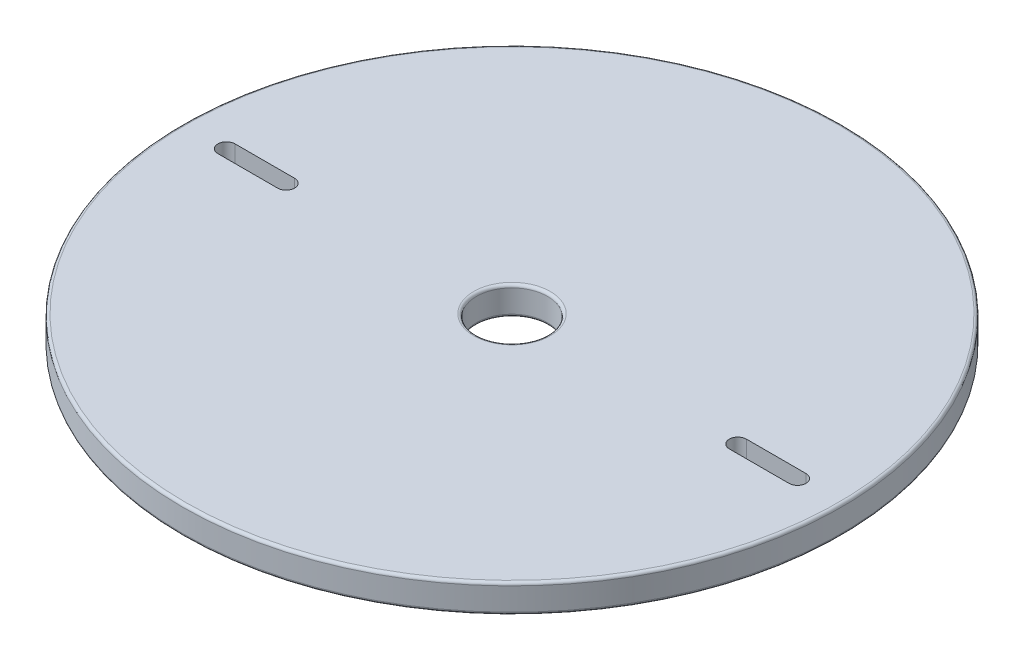
ISO-10303-21;
HEADER;
FILE_DESCRIPTION(('STEP AP214'),'2;1');
FILE_NAME('part.step','',(''),(''),'','','');
FILE_SCHEMA(('AUTOMOTIVE_DESIGN { 1 0 10303 214 1 1 1 1 }'));
ENDSEC;
DATA;
#1=APPLICATION_CONTEXT('core data for automotive mechanical design processes');
#2=APPLICATION_PROTOCOL_DEFINITION('international standard','automotive_design',2000,#1);
#3=PRODUCT_CONTEXT('',#1,'mechanical');
#4=PRODUCT('Part','Part','',(#3));
#5=PRODUCT_RELATED_PRODUCT_CATEGORY('part','',(#4));
#6=PRODUCT_DEFINITION_FORMATION('','',#4);
#7=PRODUCT_DEFINITION_CONTEXT('part definition',#1,'design');
#8=PRODUCT_DEFINITION('design','',#6,#7);
#9=PRODUCT_DEFINITION_SHAPE('','',#8);
#10=(LENGTH_UNIT() NAMED_UNIT(*) SI_UNIT(.MILLI.,.METRE.));
#11=(NAMED_UNIT(*) PLANE_ANGLE_UNIT() SI_UNIT($,.RADIAN.));
#12=(NAMED_UNIT(*) SI_UNIT($,.STERADIAN.) SOLID_ANGLE_UNIT());
#13=UNCERTAINTY_MEASURE_WITH_UNIT(LENGTH_MEASURE(1.E-05),#10,'distance_accuracy_value','');
#14=(GEOMETRIC_REPRESENTATION_CONTEXT(3) GLOBAL_UNCERTAINTY_ASSIGNED_CONTEXT((#13)) GLOBAL_UNIT_ASSIGNED_CONTEXT((#10,
#11,#12)) REPRESENTATION_CONTEXT('',''));
#15=CARTESIAN_POINT('',(0.,0.,0.));
#16=DIRECTION('',(0.,0.,1.));
#17=DIRECTION('',(1.,0.,0.));
#18=AXIS2_PLACEMENT_3D('',#15,#16,#17);
#19=CARTESIAN_POINT('',(0.,0.5,0.));
#20=DIRECTION('',(0.,1.,0.));
#21=DIRECTION('',(0.,0.,1.));
#22=AXIS2_PLACEMENT_3D('',#19,#20,#21);
#23=PLANE('',#22);
#24=CARTESIAN_POINT('',(0.,0.5,0.));
#25=DIRECTION('',(0.,1.,0.));
#26=DIRECTION('',(0.,0.,1.));
#27=AXIS2_PLACEMENT_3D('',#24,#25,#26);
#28=CIRCLE('',#27,11.5);
#29=CARTESIAN_POINT('',(0.,0.5,11.5));
#30=VERTEX_POINT('',#29);
#31=EDGE_CURVE('E176',#30,#30,#28,.T.);
#32=ORIENTED_EDGE('',*,*,#31,.T.);
#33=EDGE_LOOP('',(#32));
#34=FACE_BOUND('',#33,.T.);
#35=CARTESIAN_POINT('',(0.,0.5,0.));
#36=DIRECTION('',(0.,1.,0.));
#37=DIRECTION('',(0.,0.,1.));
#38=AXIS2_PLACEMENT_3D('',#35,#36,#37);
#39=CIRCLE('',#38,1.35);
#40=CARTESIAN_POINT('',(0.,0.5,1.35));
#41=VERTEX_POINT('',#40);
#42=EDGE_CURVE('E173',#41,#41,#39,.F.);
#43=ORIENTED_EDGE('',*,*,#42,.T.);
#44=EDGE_LOOP('',(#43));
#45=FACE_BOUND('',#44,.T.);
#46=CARTESIAN_POINT('',(-10.05,0.5,0.));
#47=DIRECTION('',(0.,1.,0.));
#48=DIRECTION('',(0.,0.,1.));
#49=AXIS2_PLACEMENT_3D('',#46,#47,#48);
#50=CIRCLE('',#49,0.3);
#51=CARTESIAN_POINT('',(-10.05,0.5,-0.3));
#52=VERTEX_POINT('',#51);
#53=CARTESIAN_POINT('',(-10.05,0.5,0.3));
#54=VERTEX_POINT('',#53);
#55=EDGE_CURVE('E138',#52,#54,#50,.T.);
#56=ORIENTED_EDGE('',*,*,#55,.F.);
#57=DIRECTION('',(-1.,0.,0.));
#58=VECTOR('',#57,1.);
#59=CARTESIAN_POINT('',(-10.05,0.5,-0.3));
#60=LINE('',#59,#58);
#61=CARTESIAN_POINT('',(-7.95,0.5,-0.3));
#62=VERTEX_POINT('',#61);
#63=EDGE_CURVE('E146',#62,#52,#60,.T.);
#64=ORIENTED_EDGE('',*,*,#63,.F.);
#65=CARTESIAN_POINT('',(-7.95,0.5,0.));
#66=DIRECTION('',(0.,1.,0.));
#67=DIRECTION('',(0.,0.,1.));
#68=AXIS2_PLACEMENT_3D('',#65,#66,#67);
#69=CIRCLE('',#68,0.3);
#70=CARTESIAN_POINT('',(-7.95,0.5,0.3));
#71=VERTEX_POINT('',#70);
#72=EDGE_CURVE('E143',#71,#62,#69,.T.);
#73=ORIENTED_EDGE('',*,*,#72,.F.);
#74=DIRECTION('',(1.,0.,0.));
#75=VECTOR('',#74,1.);
#76=CARTESIAN_POINT('',(-10.05,0.5,0.3));
#77=LINE('',#76,#75);
#78=EDGE_CURVE('E140',#54,#71,#77,.T.);
#79=ORIENTED_EDGE('',*,*,#78,.F.);
#80=EDGE_LOOP('',(#56,#64,#73,#79));
#81=FACE_BOUND('',#80,.T.);
#82=DIRECTION('',(1.,0.,0.));
#83=VECTOR('',#82,1.);
#84=CARTESIAN_POINT('',(10.05,0.5,-0.3));
#85=LINE('',#84,#83);
#86=CARTESIAN_POINT('',(7.95,0.5,-0.3));
#87=VERTEX_POINT('',#86);
#88=CARTESIAN_POINT('',(10.05,0.5,-0.3));
#89=VERTEX_POINT('',#88);
#90=EDGE_CURVE('E115',#87,#89,#85,.T.);
#91=ORIENTED_EDGE('',*,*,#90,.T.);
#92=CARTESIAN_POINT('',(10.05,0.5,0.));
#93=DIRECTION('',(0.,-1.,0.));
#94=DIRECTION('',(0.,0.,1.));
#95=AXIS2_PLACEMENT_3D('',#92,#93,#94);
#96=CIRCLE('',#95,0.3);
#97=CARTESIAN_POINT('',(10.05,0.5,0.3));
#98=VERTEX_POINT('',#97);
#99=EDGE_CURVE('E47',#89,#98,#96,.T.);
#100=ORIENTED_EDGE('',*,*,#99,.T.);
#101=DIRECTION('',(-1.,0.,0.));
#102=VECTOR('',#101,1.);
#103=CARTESIAN_POINT('',(10.05,0.5,0.3));
#104=LINE('',#103,#102);
#105=CARTESIAN_POINT('',(7.95,0.5,0.3));
#106=VERTEX_POINT('',#105);
#107=EDGE_CURVE('E109',#98,#106,#104,.T.);
#108=ORIENTED_EDGE('',*,*,#107,.T.);
#109=CARTESIAN_POINT('',(7.95,0.5,0.));
#110=DIRECTION('',(0.,-1.,0.));
#111=DIRECTION('',(0.,0.,1.));
#112=AXIS2_PLACEMENT_3D('',#109,#110,#111);
#113=CIRCLE('',#112,0.3);
#114=EDGE_CURVE('E122',#106,#87,#113,.T.);
#115=ORIENTED_EDGE('',*,*,#114,.T.);
#116=EDGE_LOOP('',(#91,#100,#108,#115));
#117=FACE_BOUND('',#116,.T.);
#118=ADVANCED_FACE('F32',(#34,#45,#81,#117),#23,.T.);
#119=CARTESIAN_POINT('',(0.,-0.5,0.));
#120=DIRECTION('',(0.,1.,0.));
#121=DIRECTION('',(0.,0.,1.));
#122=AXIS2_PLACEMENT_3D('',#119,#120,#121);
#123=PLANE('',#122);
#124=CARTESIAN_POINT('',(0.,-0.5,0.));
#125=DIRECTION('',(0.,1.,0.));
#126=DIRECTION('',(0.,0.,1.));
#127=AXIS2_PLACEMENT_3D('',#124,#125,#126);
#128=CIRCLE('',#127,11.5);
#129=CARTESIAN_POINT('',(0.,-0.5,11.5));
#130=VERTEX_POINT('',#129);
#131=EDGE_CURVE('E170',#130,#130,#128,.F.);
#132=ORIENTED_EDGE('',*,*,#131,.T.);
#133=EDGE_LOOP('',(#132));
#134=FACE_BOUND('',#133,.T.);
#135=CARTESIAN_POINT('',(0.,-0.5,0.));
#136=DIRECTION('',(0.,1.,0.));
#137=DIRECTION('',(0.,0.,1.));
#138=AXIS2_PLACEMENT_3D('',#135,#136,#137);
#139=CIRCLE('',#138,1.35);
#140=CARTESIAN_POINT('',(0.,-0.5,1.35));
#141=VERTEX_POINT('',#140);
#142=EDGE_CURVE('E167',#141,#141,#139,.T.);
#143=ORIENTED_EDGE('',*,*,#142,.T.);
#144=EDGE_LOOP('',(#143));
#145=FACE_BOUND('',#144,.T.);
#146=DIRECTION('',(1.,0.,0.));
#147=VECTOR('',#146,1.);
#148=CARTESIAN_POINT('',(-10.05,-0.5,-0.3));
#149=LINE('',#148,#147);
#150=CARTESIAN_POINT('',(-10.05,-0.5,-0.3));
#151=VERTEX_POINT('',#150);
#152=CARTESIAN_POINT('',(-7.95,-0.5,-0.3));
#153=VERTEX_POINT('',#152);
#154=EDGE_CURVE('E132',#151,#153,#149,.T.);
#155=ORIENTED_EDGE('',*,*,#154,.F.);
#156=CARTESIAN_POINT('',(-10.05,-0.5,0.));
#157=DIRECTION('',(0.,1.,0.));
#158=DIRECTION('',(0.,0.,1.));
#159=AXIS2_PLACEMENT_3D('',#156,#157,#158);
#160=CIRCLE('',#159,0.3);
#161=CARTESIAN_POINT('',(-10.05,-0.5,0.3));
#162=VERTEX_POINT('',#161);
#163=EDGE_CURVE('E135',#162,#151,#160,.F.);
#164=ORIENTED_EDGE('',*,*,#163,.F.);
#165=DIRECTION('',(-1.,0.,0.));
#166=VECTOR('',#165,1.);
#167=CARTESIAN_POINT('',(-10.05,-0.5,0.3));
#168=LINE('',#167,#166);
#169=CARTESIAN_POINT('',(-7.95,-0.5,0.3));
#170=VERTEX_POINT('',#169);
#171=EDGE_CURVE('E152',#170,#162,#168,.T.);
#172=ORIENTED_EDGE('',*,*,#171,.F.);
#173=CARTESIAN_POINT('',(-7.95,-0.5,0.));
#174=DIRECTION('',(0.,1.,0.));
#175=DIRECTION('',(0.,0.,1.));
#176=AXIS2_PLACEMENT_3D('',#173,#174,#175);
#177=CIRCLE('',#176,0.3);
#178=EDGE_CURVE('E103',#153,#170,#177,.F.);
#179=ORIENTED_EDGE('',*,*,#178,.F.);
#180=EDGE_LOOP('',(#155,#164,#172,#179));
#181=FACE_BOUND('',#180,.T.);
#182=CARTESIAN_POINT('',(10.05,-0.5,0.));
#183=DIRECTION('',(0.,1.,0.));
#184=DIRECTION('',(0.,0.,1.));
#185=AXIS2_PLACEMENT_3D('',#182,#183,#184);
#186=CIRCLE('',#185,0.3);
#187=CARTESIAN_POINT('',(10.05,-0.5,0.3));
#188=VERTEX_POINT('',#187);
#189=CARTESIAN_POINT('',(10.05,-0.5,-0.3));
#190=VERTEX_POINT('',#189);
#191=EDGE_CURVE('E107',#188,#190,#186,.T.);
#192=ORIENTED_EDGE('',*,*,#191,.T.);
#193=DIRECTION('',(-1.,0.,0.));
#194=VECTOR('',#193,1.);
#195=CARTESIAN_POINT('',(10.05,-0.5,-0.3));
#196=LINE('',#195,#194);
#197=CARTESIAN_POINT('',(7.95,-0.5,-0.3));
#198=VERTEX_POINT('',#197);
#199=EDGE_CURVE('E96',#190,#198,#196,.T.);
#200=ORIENTED_EDGE('',*,*,#199,.T.);
#201=CARTESIAN_POINT('',(7.95,-0.5,0.));
#202=DIRECTION('',(0.,1.,0.));
#203=DIRECTION('',(0.,0.,1.));
#204=AXIS2_PLACEMENT_3D('',#201,#202,#203);
#205=CIRCLE('',#204,0.3);
#206=CARTESIAN_POINT('',(7.95,-0.5,0.3));
#207=VERTEX_POINT('',#206);
#208=EDGE_CURVE('E117',#198,#207,#205,.T.);
#209=ORIENTED_EDGE('',*,*,#208,.T.);
#210=DIRECTION('',(1.,0.,0.));
#211=VECTOR('',#210,1.);
#212=CARTESIAN_POINT('',(10.05,-0.5,0.3));
#213=LINE('',#212,#211);
#214=EDGE_CURVE('E113',#207,#188,#213,.T.);
#215=ORIENTED_EDGE('',*,*,#214,.T.);
#216=EDGE_LOOP('',(#192,#200,#209,#215));
#217=FACE_BOUND('',#216,.T.);
#218=ADVANCED_FACE('F112',(#134,#145,#181,#217),#123,.F.);
#219=CARTESIAN_POINT('',(0.,0.5,0.));
#220=DIRECTION('',(0.,-1.,0.));
#221=DIRECTION('',(0.,0.,-1.));
#222=AXIS2_PLACEMENT_3D('',#219,#220,#221);
#223=CYLINDRICAL_SURFACE('',#222,11.6);
#224=CARTESIAN_POINT('',(0.,-0.4,0.));
#225=DIRECTION('',(0.,1.,0.));
#226=DIRECTION('',(0.,0.,1.));
#227=AXIS2_PLACEMENT_3D('',#224,#225,#226);
#228=CIRCLE('',#227,11.6);
#229=CARTESIAN_POINT('',(0.,-0.4,11.6));
#230=VERTEX_POINT('',#229);
#231=EDGE_CURVE('E164',#230,#230,#228,.T.);
#232=ORIENTED_EDGE('',*,*,#231,.T.);
#233=EDGE_LOOP('',(#232));
#234=FACE_BOUND('',#233,.T.);
#235=CARTESIAN_POINT('',(0.,0.4,0.));
#236=DIRECTION('',(0.,1.,0.));
#237=DIRECTION('',(0.,0.,1.));
#238=AXIS2_PLACEMENT_3D('',#235,#236,#237);
#239=CIRCLE('',#238,11.6);
#240=CARTESIAN_POINT('',(0.,0.4,11.6));
#241=VERTEX_POINT('',#240);
#242=EDGE_CURVE('E161',#241,#241,#239,.F.);
#243=ORIENTED_EDGE('',*,*,#242,.T.);
#244=EDGE_LOOP('',(#243));
#245=FACE_BOUND('',#244,.T.);
#246=ADVANCED_FACE('F198',(#234,#245),#223,.T.);
#247=CARTESIAN_POINT('',(-10.05,-0.501,0.));
#248=DIRECTION('',(0.,1.,0.));
#249=DIRECTION('',(0.,0.,1.));
#250=AXIS2_PLACEMENT_3D('',#247,#248,#249);
#251=CYLINDRICAL_SURFACE('',#250,0.3);
#252=ORIENTED_EDGE('',*,*,#163,.T.);
#253=DIRECTION('',(0.,1.,0.));
#254=VECTOR('',#253,1.);
#255=CARTESIAN_POINT('',(-10.05,-0.501,-0.3));
#256=LINE('',#255,#254);
#257=EDGE_CURVE('E150',#151,#52,#256,.T.);
#258=ORIENTED_EDGE('',*,*,#257,.T.);
#259=ORIENTED_EDGE('',*,*,#55,.T.);
#260=DIRECTION('',(0.,1.,0.));
#261=VECTOR('',#260,1.);
#262=CARTESIAN_POINT('',(-10.05,-0.501,0.3));
#263=LINE('',#262,#261);
#264=EDGE_CURVE('E149',#162,#54,#263,.T.);
#265=ORIENTED_EDGE('',*,*,#264,.F.);
#266=EDGE_LOOP('',(#252,#258,#259,#265));
#267=FACE_BOUND('',#266,.T.);
#268=ADVANCED_FACE('F203',(#267),#251,.F.);
#269=CARTESIAN_POINT('',(-10.05,-0.501,-0.3));
#270=DIRECTION('',(0.,0.,-1.));
#271=DIRECTION('',(-1.,0.,0.));
#272=AXIS2_PLACEMENT_3D('',#269,#270,#271);
#273=PLANE('',#272);
#274=ORIENTED_EDGE('',*,*,#154,.T.);
#275=DIRECTION('',(0.,1.,0.));
#276=VECTOR('',#275,1.);
#277=CARTESIAN_POINT('',(-7.95,-0.501,-0.3));
#278=LINE('',#277,#276);
#279=EDGE_CURVE('E153',#153,#62,#278,.T.);
#280=ORIENTED_EDGE('',*,*,#279,.T.);
#281=ORIENTED_EDGE('',*,*,#63,.T.);
#282=ORIENTED_EDGE('',*,*,#257,.F.);
#283=EDGE_LOOP('',(#274,#280,#281,#282));
#284=FACE_BOUND('',#283,.T.);
#285=ADVANCED_FACE('F306',(#284),#273,.F.);
#286=CARTESIAN_POINT('',(-7.95,-0.501,0.));
#287=DIRECTION('',(0.,1.,0.));
#288=DIRECTION('',(0.,0.,1.));
#289=AXIS2_PLACEMENT_3D('',#286,#287,#288);
#290=CYLINDRICAL_SURFACE('',#289,0.3);
#291=ORIENTED_EDGE('',*,*,#178,.T.);
#292=DIRECTION('',(0.,1.,0.));
#293=VECTOR('',#292,1.);
#294=CARTESIAN_POINT('',(-7.95,-0.501,0.3));
#295=LINE('',#294,#293);
#296=EDGE_CURVE('E155',#170,#71,#295,.T.);
#297=ORIENTED_EDGE('',*,*,#296,.T.);
#298=ORIENTED_EDGE('',*,*,#72,.T.);
#299=ORIENTED_EDGE('',*,*,#279,.F.);
#300=EDGE_LOOP('',(#291,#297,#298,#299));
#301=FACE_BOUND('',#300,.T.);
#302=ADVANCED_FACE('F298',(#301),#290,.F.);
#303=CARTESIAN_POINT('',(-10.05,-0.501,0.3));
#304=DIRECTION('',(0.,0.,1.));
#305=DIRECTION('',(1.,0.,0.));
#306=AXIS2_PLACEMENT_3D('',#303,#304,#305);
#307=PLANE('',#306);
#308=ORIENTED_EDGE('',*,*,#171,.T.);
#309=ORIENTED_EDGE('',*,*,#264,.T.);
#310=ORIENTED_EDGE('',*,*,#78,.T.);
#311=ORIENTED_EDGE('',*,*,#296,.F.);
#312=EDGE_LOOP('',(#308,#309,#310,#311));
#313=FACE_BOUND('',#312,.T.);
#314=ADVANCED_FACE('F281',(#313),#307,.F.);
#315=CARTESIAN_POINT('',(10.05,-0.501,0.));
#316=DIRECTION('',(0.,1.,0.));
#317=DIRECTION('',(0.,0.,1.));
#318=AXIS2_PLACEMENT_3D('',#315,#316,#317);
#319=CYLINDRICAL_SURFACE('',#318,0.3);
#320=DIRECTION('',(0.,1.,0.));
#321=VECTOR('',#320,1.);
#322=CARTESIAN_POINT('',(10.05,-0.501,0.3));
#323=LINE('',#322,#321);
#324=EDGE_CURVE('E104',#188,#98,#323,.T.);
#325=ORIENTED_EDGE('',*,*,#324,.T.);
#326=ORIENTED_EDGE('',*,*,#99,.F.);
#327=DIRECTION('',(0.,1.,0.));
#328=VECTOR('',#327,1.);
#329=CARTESIAN_POINT('',(10.05,-0.501,-0.3));
#330=LINE('',#329,#328);
#331=EDGE_CURVE('E98',#190,#89,#330,.T.);
#332=ORIENTED_EDGE('',*,*,#331,.F.);
#333=ORIENTED_EDGE('',*,*,#191,.F.);
#334=EDGE_LOOP('',(#325,#326,#332,#333));
#335=FACE_BOUND('',#334,.T.);
#336=ADVANCED_FACE('F106',(#335),#319,.F.);
#337=CARTESIAN_POINT('',(10.05,-0.501,0.3));
#338=DIRECTION('',(0.,0.,-1.));
#339=DIRECTION('',(-1.,0.,0.));
#340=AXIS2_PLACEMENT_3D('',#337,#338,#339);
#341=PLANE('',#340);
#342=DIRECTION('',(0.,1.,0.));
#343=VECTOR('',#342,1.);
#344=CARTESIAN_POINT('',(7.95,-0.501,0.3));
#345=LINE('',#344,#343);
#346=EDGE_CURVE('E128',#207,#106,#345,.T.);
#347=ORIENTED_EDGE('',*,*,#346,.T.);
#348=ORIENTED_EDGE('',*,*,#107,.F.);
#349=ORIENTED_EDGE('',*,*,#324,.F.);
#350=ORIENTED_EDGE('',*,*,#214,.F.);
#351=EDGE_LOOP('',(#347,#348,#349,#350));
#352=FACE_BOUND('',#351,.T.);
#353=ADVANCED_FACE('F264',(#352),#341,.T.);
#354=CARTESIAN_POINT('',(7.95,-0.501,0.));
#355=DIRECTION('',(0.,1.,0.));
#356=DIRECTION('',(0.,0.,1.));
#357=AXIS2_PLACEMENT_3D('',#354,#355,#356);
#358=CYLINDRICAL_SURFACE('',#357,0.3);
#359=DIRECTION('',(0.,1.,0.));
#360=VECTOR('',#359,1.);
#361=CARTESIAN_POINT('',(7.95,-0.501,-0.3));
#362=LINE('',#361,#360);
#363=EDGE_CURVE('E55',#198,#87,#362,.T.);
#364=ORIENTED_EDGE('',*,*,#363,.T.);
#365=ORIENTED_EDGE('',*,*,#114,.F.);
#366=ORIENTED_EDGE('',*,*,#346,.F.);
#367=ORIENTED_EDGE('',*,*,#208,.F.);
#368=EDGE_LOOP('',(#364,#365,#366,#367));
#369=FACE_BOUND('',#368,.T.);
#370=ADVANCED_FACE('F256',(#369),#358,.F.);
#371=CARTESIAN_POINT('',(10.05,-0.501,-0.3));
#372=DIRECTION('',(0.,0.,1.));
#373=DIRECTION('',(1.,0.,0.));
#374=AXIS2_PLACEMENT_3D('',#371,#372,#373);
#375=PLANE('',#374);
#376=ORIENTED_EDGE('',*,*,#331,.T.);
#377=ORIENTED_EDGE('',*,*,#90,.F.);
#378=ORIENTED_EDGE('',*,*,#363,.F.);
#379=ORIENTED_EDGE('',*,*,#199,.F.);
#380=EDGE_LOOP('',(#376,#377,#378,#379));
#381=FACE_BOUND('',#380,.T.);
#382=ADVANCED_FACE('F97',(#381),#375,.T.);
#383=CARTESIAN_POINT('',(0.,-0.501,0.));
#384=DIRECTION('',(0.,1.,0.));
#385=DIRECTION('',(0.,0.,1.));
#386=AXIS2_PLACEMENT_3D('',#383,#384,#385);
#387=CYLINDRICAL_SURFACE('',#386,1.25);
#388=CARTESIAN_POINT('',(0.,-0.4,0.));
#389=DIRECTION('',(0.,1.,0.));
#390=DIRECTION('',(0.,0.,1.));
#391=AXIS2_PLACEMENT_3D('',#388,#389,#390);
#392=CIRCLE('',#391,1.25);
#393=CARTESIAN_POINT('',(0.,-0.4,1.25));
#394=VERTEX_POINT('',#393);
#395=EDGE_CURVE('E11',#394,#394,#392,.F.);
#396=ORIENTED_EDGE('',*,*,#395,.T.);
#397=EDGE_LOOP('',(#396));
#398=FACE_BOUND('',#397,.T.);
#399=CARTESIAN_POINT('',(0.,0.4,0.));
#400=DIRECTION('',(0.,1.,0.));
#401=DIRECTION('',(0.,0.,1.));
#402=AXIS2_PLACEMENT_3D('',#399,#400,#401);
#403=CIRCLE('',#402,1.25);
#404=CARTESIAN_POINT('',(0.,0.4,1.25));
#405=VERTEX_POINT('',#404);
#406=EDGE_CURVE('E40',#405,#405,#403,.T.);
#407=ORIENTED_EDGE('',*,*,#406,.T.);
#408=EDGE_LOOP('',(#407));
#409=FACE_BOUND('',#408,.T.);
#410=ADVANCED_FACE('F181',(#398,#409),#387,.F.);
#411=CARTESIAN_POINT('',(0.,-0.4,0.));
#412=DIRECTION('',(0.,1.,0.));
#413=DIRECTION('',(0.,0.,1.));
#414=AXIS2_PLACEMENT_3D('',#411,#412,#413);
#415=TOROIDAL_SURFACE('',#414,11.5,0.1);
#416=ORIENTED_EDGE('',*,*,#131,.F.);
#417=EDGE_LOOP('',(#416));
#418=FACE_BOUND('',#417,.T.);
#419=ORIENTED_EDGE('',*,*,#231,.F.);
#420=EDGE_LOOP('',(#419));
#421=FACE_BOUND('',#420,.T.);
#422=ADVANCED_FACE('F209',(#418,#421),#415,.T.);
#423=CARTESIAN_POINT('',(0.,0.4,0.));
#424=DIRECTION('',(0.,1.,0.));
#425=DIRECTION('',(0.,0.,1.));
#426=AXIS2_PLACEMENT_3D('',#423,#424,#425);
#427=TOROIDAL_SURFACE('',#426,11.5,0.1);
#428=ORIENTED_EDGE('',*,*,#242,.F.);
#429=EDGE_LOOP('',(#428));
#430=FACE_BOUND('',#429,.T.);
#431=ORIENTED_EDGE('',*,*,#31,.F.);
#432=EDGE_LOOP('',(#431));
#433=FACE_BOUND('',#432,.T.);
#434=ADVANCED_FACE('F189',(#430,#433),#427,.T.);
#435=CARTESIAN_POINT('',(0.,-0.4,0.));
#436=DIRECTION('',(0.,1.,0.));
#437=DIRECTION('',(0.,0.,1.));
#438=AXIS2_PLACEMENT_3D('',#435,#436,#437);
#439=TOROIDAL_SURFACE('',#438,1.35,0.1);
#440=ORIENTED_EDGE('',*,*,#142,.F.);
#441=EDGE_LOOP('',(#440));
#442=FACE_BOUND('',#441,.T.);
#443=ORIENTED_EDGE('',*,*,#395,.F.);
#444=EDGE_LOOP('',(#443));
#445=FACE_BOUND('',#444,.T.);
#446=ADVANCED_FACE('F184',(#442,#445),#439,.T.);
#447=CARTESIAN_POINT('',(0.,0.4,0.));
#448=DIRECTION('',(0.,1.,0.));
#449=DIRECTION('',(0.,0.,1.));
#450=AXIS2_PLACEMENT_3D('',#447,#448,#449);
#451=TOROIDAL_SURFACE('',#450,1.35,0.1);
#452=ORIENTED_EDGE('',*,*,#42,.F.);
#453=EDGE_LOOP('',(#452));
#454=FACE_BOUND('',#453,.T.);
#455=ORIENTED_EDGE('',*,*,#406,.F.);
#456=EDGE_LOOP('',(#455));
#457=FACE_BOUND('',#456,.T.);
#458=ADVANCED_FACE('F34',(#454,#457),#451,.T.);
#459=CLOSED_SHELL('',(#118,#218,#246,#268,#285,#302,#314,#336,#353,#370,#382,#410,#422,#434,
#446,#458));
#460=MANIFOLD_SOLID_BREP('B2',#459);
#461=ADVANCED_BREP_SHAPE_REPRESENTATION('',(#18,#460),#14);
#462=SHAPE_DEFINITION_REPRESENTATION(#9,#461);
ENDSEC;
END-ISO-10303-21;
